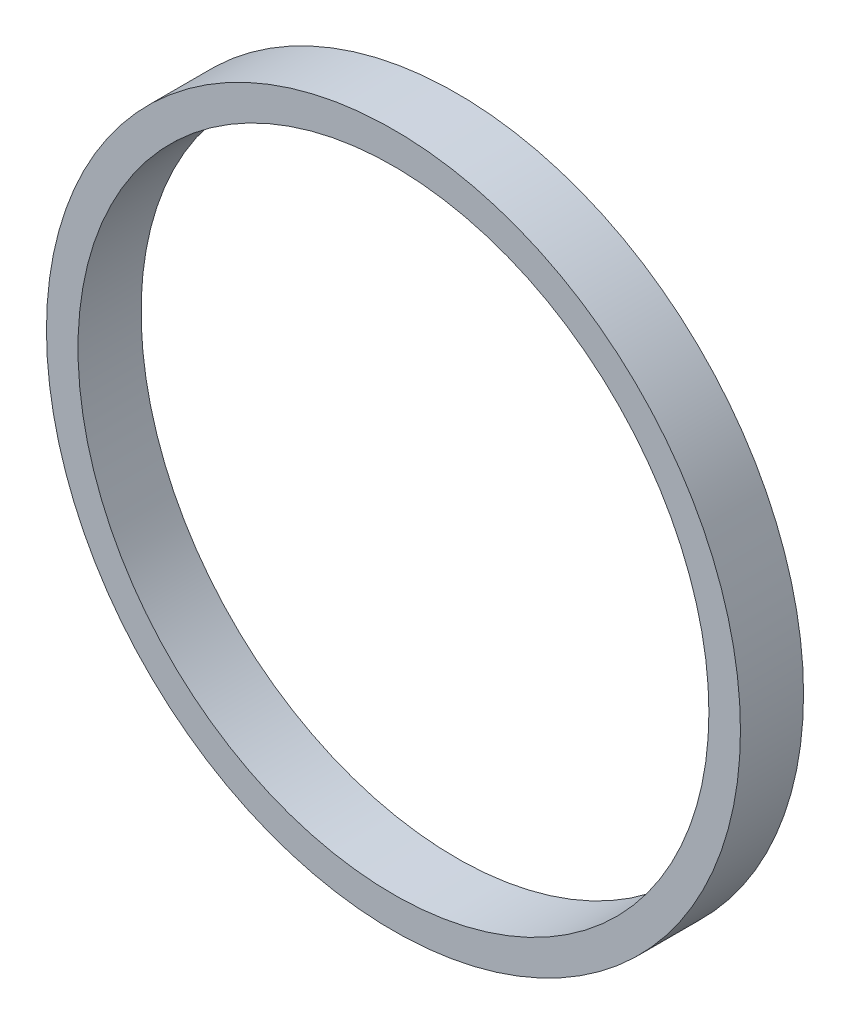
ISO-10303-21;
HEADER;
FILE_DESCRIPTION(('STEP AP214'),'2;1');
FILE_NAME('part.step','',(''),(''),'','','');
FILE_SCHEMA(('AUTOMOTIVE_DESIGN { 1 0 10303 214 1 1 1 1 }'));
ENDSEC;
DATA;
#1=APPLICATION_CONTEXT('core data for automotive mechanical design processes');
#2=APPLICATION_PROTOCOL_DEFINITION('international standard','automotive_design',2000,#1);
#3=PRODUCT_CONTEXT('',#1,'mechanical');
#4=PRODUCT('Part','Part','',(#3));
#5=PRODUCT_RELATED_PRODUCT_CATEGORY('part','',(#4));
#6=PRODUCT_DEFINITION_FORMATION('','',#4);
#7=PRODUCT_DEFINITION_CONTEXT('part definition',#1,'design');
#8=PRODUCT_DEFINITION('design','',#6,#7);
#9=PRODUCT_DEFINITION_SHAPE('','',#8);
#10=(LENGTH_UNIT() NAMED_UNIT(*) SI_UNIT(.MILLI.,.METRE.));
#11=(NAMED_UNIT(*) PLANE_ANGLE_UNIT() SI_UNIT($,.RADIAN.));
#12=(NAMED_UNIT(*) SI_UNIT($,.STERADIAN.) SOLID_ANGLE_UNIT());
#13=UNCERTAINTY_MEASURE_WITH_UNIT(LENGTH_MEASURE(1.E-05),#10,'distance_accuracy_value','');
#14=(GEOMETRIC_REPRESENTATION_CONTEXT(3) GLOBAL_UNCERTAINTY_ASSIGNED_CONTEXT((#13)) GLOBAL_UNIT_ASSIGNED_CONTEXT((#10,
#11,#12)) REPRESENTATION_CONTEXT('',''));
#15=CARTESIAN_POINT('',(0.,0.,0.));
#16=DIRECTION('',(0.,0.,1.));
#17=DIRECTION('',(1.,0.,0.));
#18=AXIS2_PLACEMENT_3D('',#15,#16,#17);
#19=CARTESIAN_POINT('',(0.,0.,10.));
#20=DIRECTION('',(0.,0.,1.));
#21=DIRECTION('',(1.,0.,0.));
#22=AXIS2_PLACEMENT_3D('',#19,#20,#21);
#23=PLANE('',#22);
#24=CARTESIAN_POINT('',(0.,0.,10.));
#25=DIRECTION('',(0.,0.,1.));
#26=DIRECTION('',(1.,0.,0.));
#27=AXIS2_PLACEMENT_3D('',#24,#25,#26);
#28=CIRCLE('',#27,55.);
#29=CARTESIAN_POINT('',(55.,0.,10.));
#30=VERTEX_POINT('',#29);
#31=EDGE_CURVE('E10',#30,#30,#28,.T.);
#32=ORIENTED_EDGE('',*,*,#31,.T.);
#33=EDGE_LOOP('',(#32));
#34=FACE_BOUND('',#33,.T.);
#35=CARTESIAN_POINT('',(0.,0.,10.));
#36=DIRECTION('',(0.,0.,1.));
#37=DIRECTION('',(1.,0.,0.));
#38=AXIS2_PLACEMENT_3D('',#35,#36,#37);
#39=CIRCLE('',#38,50.);
#40=CARTESIAN_POINT('',(50.,0.,10.));
#41=VERTEX_POINT('',#40);
#42=EDGE_CURVE('E49',#41,#41,#39,.T.);
#43=ORIENTED_EDGE('',*,*,#42,.F.);
#44=EDGE_LOOP('',(#43));
#45=FACE_BOUND('',#44,.T.);
#46=ADVANCED_FACE('F39',(#34,#45),#23,.T.);
#47=CARTESIAN_POINT('',(0.,0.,0.));
#48=DIRECTION('',(0.,0.,1.));
#49=DIRECTION('',(1.,0.,0.));
#50=AXIS2_PLACEMENT_3D('',#47,#48,#49);
#51=PLANE('',#50);
#52=CARTESIAN_POINT('',(0.,0.,0.));
#53=DIRECTION('',(0.,0.,1.));
#54=DIRECTION('',(1.,0.,0.));
#55=AXIS2_PLACEMENT_3D('',#52,#53,#54);
#56=CIRCLE('',#55,55.);
#57=CARTESIAN_POINT('',(55.,0.,0.));
#58=VERTEX_POINT('',#57);
#59=EDGE_CURVE('E43',#58,#58,#56,.T.);
#60=ORIENTED_EDGE('',*,*,#59,.F.);
#61=EDGE_LOOP('',(#60));
#62=FACE_BOUND('',#61,.T.);
#63=CARTESIAN_POINT('',(0.,0.,0.));
#64=DIRECTION('',(0.,0.,1.));
#65=DIRECTION('',(1.,0.,0.));
#66=AXIS2_PLACEMENT_3D('',#63,#64,#65);
#67=CIRCLE('',#66,50.);
#68=CARTESIAN_POINT('',(50.,0.,0.));
#69=VERTEX_POINT('',#68);
#70=EDGE_CURVE('E55',#69,#69,#67,.T.);
#71=ORIENTED_EDGE('',*,*,#70,.T.);
#72=EDGE_LOOP('',(#71));
#73=FACE_BOUND('',#72,.T.);
#74=ADVANCED_FACE('F64',(#62,#73),#51,.F.);
#75=CARTESIAN_POINT('',(0.,0.,10.));
#76=DIRECTION('',(0.,0.,-1.));
#77=DIRECTION('',(-1.,0.,0.));
#78=AXIS2_PLACEMENT_3D('',#75,#76,#77);
#79=CYLINDRICAL_SURFACE('',#78,55.);
#80=ORIENTED_EDGE('',*,*,#31,.F.);
#81=EDGE_LOOP('',(#80));
#82=FACE_BOUND('',#81,.T.);
#83=ORIENTED_EDGE('',*,*,#59,.T.);
#84=EDGE_LOOP('',(#83));
#85=FACE_BOUND('',#84,.T.);
#86=ADVANCED_FACE('F41',(#82,#85),#79,.T.);
#87=CARTESIAN_POINT('',(0.,0.,10.));
#88=DIRECTION('',(0.,0.,-1.));
#89=DIRECTION('',(-1.,0.,0.));
#90=AXIS2_PLACEMENT_3D('',#87,#88,#89);
#91=CYLINDRICAL_SURFACE('',#90,50.);
#92=ORIENTED_EDGE('',*,*,#42,.T.);
#93=EDGE_LOOP('',(#92));
#94=FACE_BOUND('',#93,.T.);
#95=ORIENTED_EDGE('',*,*,#70,.F.);
#96=EDGE_LOOP('',(#95));
#97=FACE_BOUND('',#96,.T.);
#98=ADVANCED_FACE('F59',(#94,#97),#91,.F.);
#99=CLOSED_SHELL('',(#46,#74,#86,#98));
#100=MANIFOLD_SOLID_BREP('B2',#99);
#101=ADVANCED_BREP_SHAPE_REPRESENTATION('',(#18,#100),#14);
#102=SHAPE_DEFINITION_REPRESENTATION(#9,#101);
ENDSEC;
END-ISO-10303-21;
